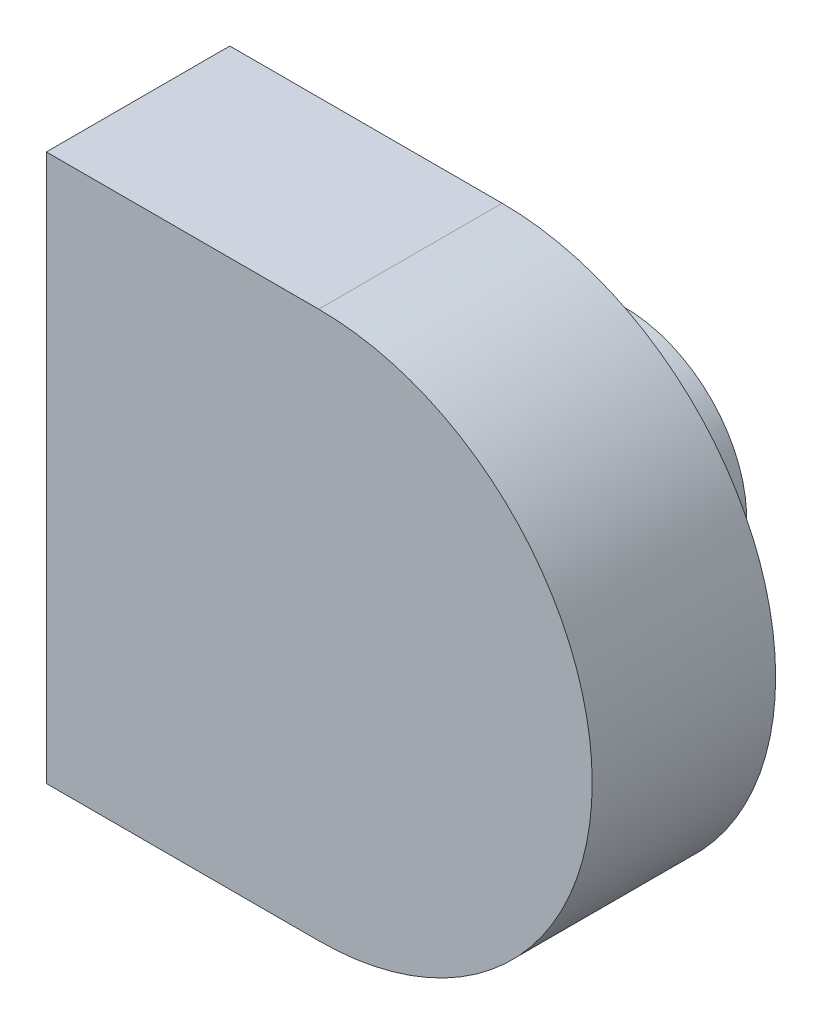
ISO-10303-21;
HEADER;
FILE_DESCRIPTION(('STEP AP214'),'2;1');
FILE_NAME('part.step','',(''),(''),'','','');
FILE_SCHEMA(('AUTOMOTIVE_DESIGN { 1 0 10303 214 1 1 1 1 }'));
ENDSEC;
DATA;
#1=APPLICATION_CONTEXT('core data for automotive mechanical design processes');
#2=APPLICATION_PROTOCOL_DEFINITION('international standard','automotive_design',2000,#1);
#3=PRODUCT_CONTEXT('',#1,'mechanical');
#4=PRODUCT('Part','Part','',(#3));
#5=PRODUCT_RELATED_PRODUCT_CATEGORY('part','',(#4));
#6=PRODUCT_DEFINITION_FORMATION('','',#4);
#7=PRODUCT_DEFINITION_CONTEXT('part definition',#1,'design');
#8=PRODUCT_DEFINITION('design','',#6,#7);
#9=PRODUCT_DEFINITION_SHAPE('','',#8);
#10=(LENGTH_UNIT() NAMED_UNIT(*) SI_UNIT(.MILLI.,.METRE.));
#11=(NAMED_UNIT(*) PLANE_ANGLE_UNIT() SI_UNIT($,.RADIAN.));
#12=(NAMED_UNIT(*) SI_UNIT($,.STERADIAN.) SOLID_ANGLE_UNIT());
#13=UNCERTAINTY_MEASURE_WITH_UNIT(LENGTH_MEASURE(1.E-05),#10,'distance_accuracy_value','');
#14=(GEOMETRIC_REPRESENTATION_CONTEXT(3) GLOBAL_UNCERTAINTY_ASSIGNED_CONTEXT((#13)) GLOBAL_UNIT_ASSIGNED_CONTEXT((#10,
#11,#12)) REPRESENTATION_CONTEXT('',''));
#15=CARTESIAN_POINT('',(0.,0.,0.));
#16=DIRECTION('',(0.,0.,1.));
#17=DIRECTION('',(1.,0.,0.));
#18=AXIS2_PLACEMENT_3D('',#15,#16,#17);
#19=CARTESIAN_POINT('',(22.27,22.365,-10.));
#20=DIRECTION('',(0.,0.,1.));
#21=DIRECTION('',(1.,0.,0.));
#22=AXIS2_PLACEMENT_3D('',#19,#20,#21);
#23=CYLINDRICAL_SURFACE('',#22,10.);
#24=CARTESIAN_POINT('',(22.27,22.365,-2.5));
#25=DIRECTION('',(0.,0.,-1.));
#26=DIRECTION('',(-1.,0.,0.));
#27=AXIS2_PLACEMENT_3D('',#24,#25,#26);
#28=CIRCLE('',#27,10.);
#29=CARTESIAN_POINT('',(12.27,22.365,-2.5));
#30=VERTEX_POINT('',#29);
#31=EDGE_CURVE('E126',#30,#30,#28,.T.);
#32=ORIENTED_EDGE('',*,*,#31,.T.);
#33=EDGE_LOOP('',(#32));
#34=FACE_BOUND('',#33,.T.);
#35=CARTESIAN_POINT('',(22.27,22.365,-10.));
#36=DIRECTION('',(0.,0.,-1.));
#37=DIRECTION('',(-1.,0.,0.));
#38=AXIS2_PLACEMENT_3D('',#35,#36,#37);
#39=CIRCLE('',#38,10.);
#40=CARTESIAN_POINT('',(12.27,22.365,-10.));
#41=VERTEX_POINT('',#40);
#42=EDGE_CURVE('E114',#41,#41,#39,.T.);
#43=ORIENTED_EDGE('',*,*,#42,.F.);
#44=EDGE_LOOP('',(#43));
#45=FACE_BOUND('',#44,.T.);
#46=ADVANCED_FACE('F44',(#34,#45),#23,.T.);
#47=CARTESIAN_POINT('',(0.,0.,-10.));
#48=DIRECTION('',(0.,0.,-1.));
#49=DIRECTION('',(-1.,0.,0.));
#50=AXIS2_PLACEMENT_3D('',#47,#48,#49);
#51=PLANE('',#50);
#52=CARTESIAN_POINT('',(22.27,29.365,-10.));
#53=DIRECTION('',(0.,0.,-1.));
#54=DIRECTION('',(-1.,0.,0.));
#55=AXIS2_PLACEMENT_3D('',#52,#53,#54);
#56=CIRCLE('',#55,0.999999999999998);
#57=CARTESIAN_POINT('',(21.27,29.365,-10.));
#58=VERTEX_POINT('',#57);
#59=EDGE_CURVE('E118',#58,#58,#56,.T.);
#60=ORIENTED_EDGE('',*,*,#59,.F.);
#61=EDGE_LOOP('',(#60));
#62=FACE_BOUND('',#61,.T.);
#63=ORIENTED_EDGE('',*,*,#42,.T.);
#64=EDGE_LOOP('',(#63));
#65=FACE_BOUND('',#64,.T.);
#66=ADVANCED_FACE('F152',(#62,#65),#51,.T.);
#67=CARTESIAN_POINT('',(22.27,29.365,-5.));
#68=DIRECTION('',(0.,0.,-1.));
#69=DIRECTION('',(-1.,0.,0.));
#70=AXIS2_PLACEMENT_3D('',#67,#68,#69);
#71=CYLINDRICAL_SURFACE('',#70,0.999999999999998);
#72=CARTESIAN_POINT('',(22.27,29.365,-5.));
#73=DIRECTION('',(0.,0.,-1.));
#74=DIRECTION('',(-1.,0.,0.));
#75=AXIS2_PLACEMENT_3D('',#72,#73,#74);
#76=CIRCLE('',#75,0.999999999999998);
#77=CARTESIAN_POINT('',(21.27,29.365,-5.));
#78=VERTEX_POINT('',#77);
#79=EDGE_CURVE('E117',#78,#78,#76,.T.);
#80=ORIENTED_EDGE('',*,*,#79,.F.);
#81=EDGE_LOOP('',(#80));
#82=FACE_BOUND('',#81,.T.);
#83=ORIENTED_EDGE('',*,*,#59,.T.);
#84=EDGE_LOOP('',(#83));
#85=FACE_BOUND('',#84,.T.);
#86=ADVANCED_FACE('F147',(#82,#85),#71,.F.);
#87=CARTESIAN_POINT('',(22.27,29.365,-5.));
#88=DIRECTION('',(0.,0.,-1.));
#89=DIRECTION('',(-1.,0.,0.));
#90=AXIS2_PLACEMENT_3D('',#87,#88,#89);
#91=PLANE('',#90);
#92=ORIENTED_EDGE('',*,*,#79,.T.);
#93=EDGE_LOOP('',(#92));
#94=FACE_BOUND('',#93,.T.);
#95=ADVANCED_FACE('F136',(#94),#91,.T.);
#96=CARTESIAN_POINT('',(22.27,22.365,-2.5));
#97=DIRECTION('',(0.,0.,-1.));
#98=DIRECTION('',(-1.,0.,0.));
#99=AXIS2_PLACEMENT_3D('',#96,#97,#98);
#100=PLANE('',#99);
#101=CARTESIAN_POINT('',(22.27,22.365,-2.5));
#102=DIRECTION('',(0.,0.,-1.));
#103=DIRECTION('',(-1.,0.,0.));
#104=AXIS2_PLACEMENT_3D('',#101,#102,#103);
#105=CIRCLE('',#104,12.);
#106=CARTESIAN_POINT('',(10.27,22.365,-2.5));
#107=VERTEX_POINT('',#106);
#108=EDGE_CURVE('E125',#107,#107,#105,.T.);
#109=ORIENTED_EDGE('',*,*,#108,.T.);
#110=EDGE_LOOP('',(#109));
#111=FACE_BOUND('',#110,.T.);
#112=ORIENTED_EDGE('',*,*,#31,.F.);
#113=EDGE_LOOP('',(#112));
#114=FACE_BOUND('',#113,.T.);
#115=ADVANCED_FACE('F137',(#111,#114),#100,.T.);
#116=CARTESIAN_POINT('',(22.27,22.365,-2.5));
#117=DIRECTION('',(0.,0.,1.));
#118=DIRECTION('',(1.,0.,0.));
#119=AXIS2_PLACEMENT_3D('',#116,#117,#118);
#120=CYLINDRICAL_SURFACE('',#119,12.);
#121=ORIENTED_EDGE('',*,*,#108,.F.);
#122=EDGE_LOOP('',(#121));
#123=FACE_BOUND('',#122,.T.);
#124=CARTESIAN_POINT('',(22.27,22.365,0.));
#125=DIRECTION('',(0.,0.,-1.));
#126=DIRECTION('',(-1.,0.,0.));
#127=AXIS2_PLACEMENT_3D('',#124,#125,#126);
#128=CIRCLE('',#127,12.);
#129=CARTESIAN_POINT('',(10.27,22.365,0.));
#130=VERTEX_POINT('',#129);
#131=EDGE_CURVE('E123',#130,#130,#128,.T.);
#132=ORIENTED_EDGE('',*,*,#131,.T.);
#133=EDGE_LOOP('',(#132));
#134=FACE_BOUND('',#133,.T.);
#135=ADVANCED_FACE('F140',(#123,#134),#120,.T.);
#136=CARTESIAN_POINT('',(0.,0.,15.));
#137=DIRECTION('',(0.,0.,-1.));
#138=DIRECTION('',(-1.,0.,0.));
#139=AXIS2_PLACEMENT_3D('',#136,#137,#138);
#140=PLANE('',#139);
#141=CARTESIAN_POINT('',(22.27,22.365,15.));
#142=DIRECTION('',(0.,0.,1.));
#143=DIRECTION('',(1.,0.,0.));
#144=AXIS2_PLACEMENT_3D('',#141,#142,#143);
#145=CIRCLE('',#144,22.365);
#146=CARTESIAN_POINT('',(22.27,0.,15.));
#147=VERTEX_POINT('',#146);
#148=CARTESIAN_POINT('',(22.27,44.73,15.));
#149=VERTEX_POINT('',#148);
#150=EDGE_CURVE('E109',#147,#149,#145,.T.);
#151=ORIENTED_EDGE('',*,*,#150,.T.);
#152=DIRECTION('',(-1.,0.,0.));
#153=VECTOR('',#152,1.);
#154=CARTESIAN_POINT('',(0.,44.73,15.));
#155=LINE('',#154,#153);
#156=CARTESIAN_POINT('',(0.,44.73,15.));
#157=VERTEX_POINT('',#156);
#158=EDGE_CURVE('E70',#149,#157,#155,.T.);
#159=ORIENTED_EDGE('',*,*,#158,.T.);
#160=DIRECTION('',(0.,-1.,0.));
#161=VECTOR('',#160,1.);
#162=CARTESIAN_POINT('',(0.,0.,15.));
#163=LINE('',#162,#161);
#164=CARTESIAN_POINT('',(0.,0.,15.));
#165=VERTEX_POINT('',#164);
#166=EDGE_CURVE('E94',#157,#165,#163,.T.);
#167=ORIENTED_EDGE('',*,*,#166,.T.);
#168=DIRECTION('',(1.,0.,0.));
#169=VECTOR('',#168,1.);
#170=CARTESIAN_POINT('',(0.,0.,15.));
#171=LINE('',#170,#169);
#172=EDGE_CURVE('E106',#165,#147,#171,.T.);
#173=ORIENTED_EDGE('',*,*,#172,.T.);
#174=EDGE_LOOP('',(#151,#159,#167,#173));
#175=FACE_BOUND('',#174,.T.);
#176=ADVANCED_FACE('F148',(#175),#140,.F.);
#177=CARTESIAN_POINT('',(0.,0.,15.));
#178=DIRECTION('',(1.,0.,0.));
#179=DIRECTION('',(0.,0.,-1.));
#180=AXIS2_PLACEMENT_3D('',#177,#178,#179);
#181=PLANE('',#180);
#182=DIRECTION('',(0.,-1.,0.));
#183=VECTOR('',#182,1.);
#184=CARTESIAN_POINT('',(0.,0.,0.));
#185=LINE('',#184,#183);
#186=CARTESIAN_POINT('',(0.,44.73,0.));
#187=VERTEX_POINT('',#186);
#188=CARTESIAN_POINT('',(0.,0.,0.));
#189=VERTEX_POINT('',#188);
#190=EDGE_CURVE('E96',#187,#189,#185,.T.);
#191=ORIENTED_EDGE('',*,*,#190,.T.);
#192=DIRECTION('',(0.,0.,-1.));
#193=VECTOR('',#192,1.);
#194=CARTESIAN_POINT('',(0.,0.,15.));
#195=LINE('',#194,#193);
#196=EDGE_CURVE('E11',#165,#189,#195,.T.);
#197=ORIENTED_EDGE('',*,*,#196,.F.);
#198=ORIENTED_EDGE('',*,*,#166,.F.);
#199=DIRECTION('',(0.,0.,-1.));
#200=VECTOR('',#199,1.);
#201=CARTESIAN_POINT('',(0.,44.73,15.));
#202=LINE('',#201,#200);
#203=EDGE_CURVE('E52',#157,#187,#202,.T.);
#204=ORIENTED_EDGE('',*,*,#203,.T.);
#205=EDGE_LOOP('',(#191,#197,#198,#204));
#206=FACE_BOUND('',#205,.T.);
#207=ADVANCED_FACE('F50',(#206),#181,.F.);
#208=CARTESIAN_POINT('',(0.,0.,15.));
#209=DIRECTION('',(0.,1.,0.));
#210=DIRECTION('',(0.,0.,1.));
#211=AXIS2_PLACEMENT_3D('',#208,#209,#210);
#212=PLANE('',#211);
#213=DIRECTION('',(1.,0.,0.));
#214=VECTOR('',#213,1.);
#215=CARTESIAN_POINT('',(0.,0.,0.));
#216=LINE('',#215,#214);
#217=CARTESIAN_POINT('',(22.27,0.,0.));
#218=VERTEX_POINT('',#217);
#219=EDGE_CURVE('E95',#189,#218,#216,.T.);
#220=ORIENTED_EDGE('',*,*,#219,.T.);
#221=DIRECTION('',(0.,0.,1.));
#222=VECTOR('',#221,1.);
#223=CARTESIAN_POINT('',(22.27,0.,-0.000999999999999265));
#224=LINE('',#223,#222);
#225=EDGE_CURVE('E58',#218,#147,#224,.T.);
#226=ORIENTED_EDGE('',*,*,#225,.T.);
#227=ORIENTED_EDGE('',*,*,#172,.F.);
#228=ORIENTED_EDGE('',*,*,#196,.T.);
#229=EDGE_LOOP('',(#220,#226,#227,#228));
#230=FACE_BOUND('',#229,.T.);
#231=ADVANCED_FACE('F164',(#230),#212,.F.);
#232=CARTESIAN_POINT('',(22.27,22.365,-0.000999999999999265));
#233=DIRECTION('',(0.,0.,1.));
#234=DIRECTION('',(1.,0.,0.));
#235=AXIS2_PLACEMENT_3D('',#232,#233,#234);
#236=CYLINDRICAL_SURFACE('',#235,22.365);
#237=CARTESIAN_POINT('',(22.27,22.365,0.));
#238=DIRECTION('',(0.,0.,-1.));
#239=DIRECTION('',(-1.,0.,0.));
#240=AXIS2_PLACEMENT_3D('',#237,#238,#239);
#241=CIRCLE('',#240,22.365);
#242=CARTESIAN_POINT('',(22.27,44.73,0.));
#243=VERTEX_POINT('',#242);
#244=EDGE_CURVE('E113',#218,#243,#241,.F.);
#245=ORIENTED_EDGE('',*,*,#244,.T.);
#246=DIRECTION('',(0.,0.,1.));
#247=VECTOR('',#246,1.);
#248=CARTESIAN_POINT('',(22.27,44.73,-0.000999999999999265));
#249=LINE('',#248,#247);
#250=EDGE_CURVE('E90',#243,#149,#249,.T.);
#251=ORIENTED_EDGE('',*,*,#250,.T.);
#252=ORIENTED_EDGE('',*,*,#150,.F.);
#253=ORIENTED_EDGE('',*,*,#225,.F.);
#254=EDGE_LOOP('',(#245,#251,#252,#253));
#255=FACE_BOUND('',#254,.T.);
#256=ADVANCED_FACE('F162',(#255),#236,.T.);
#257=CARTESIAN_POINT('',(0.,44.73,15.));
#258=DIRECTION('',(0.,-1.,0.));
#259=DIRECTION('',(0.,0.,-1.));
#260=AXIS2_PLACEMENT_3D('',#257,#258,#259);
#261=PLANE('',#260);
#262=ORIENTED_EDGE('',*,*,#250,.F.);
#263=DIRECTION('',(-1.,0.,0.));
#264=VECTOR('',#263,1.);
#265=CARTESIAN_POINT('',(0.,44.73,0.));
#266=LINE('',#265,#264);
#267=EDGE_CURVE('E81',#243,#187,#266,.T.);
#268=ORIENTED_EDGE('',*,*,#267,.T.);
#269=ORIENTED_EDGE('',*,*,#203,.F.);
#270=ORIENTED_EDGE('',*,*,#158,.F.);
#271=EDGE_LOOP('',(#262,#268,#269,#270));
#272=FACE_BOUND('',#271,.T.);
#273=ADVANCED_FACE('F82',(#272),#261,.F.);
#274=CARTESIAN_POINT('',(0.,0.,0.));
#275=DIRECTION('',(0.,0.,-1.));
#276=DIRECTION('',(-1.,0.,0.));
#277=AXIS2_PLACEMENT_3D('',#274,#275,#276);
#278=PLANE('',#277);
#279=ORIENTED_EDGE('',*,*,#131,.F.);
#280=EDGE_LOOP('',(#279));
#281=FACE_BOUND('',#280,.T.);
#282=ORIENTED_EDGE('',*,*,#267,.F.);
#283=ORIENTED_EDGE('',*,*,#244,.F.);
#284=ORIENTED_EDGE('',*,*,#219,.F.);
#285=ORIENTED_EDGE('',*,*,#190,.F.);
#286=EDGE_LOOP('',(#282,#283,#284,#285));
#287=FACE_BOUND('',#286,.T.);
#288=ADVANCED_FACE('F100',(#281,#287),#278,.T.);
#289=CLOSED_SHELL('',(#46,#66,#86,#95,#115,#135,#176,#207,#231,#256,#273,#288));
#290=MANIFOLD_SOLID_BREP('B2',#289);
#291=ADVANCED_BREP_SHAPE_REPRESENTATION('',(#18,#290),#14);
#292=SHAPE_DEFINITION_REPRESENTATION(#9,#291);
ENDSEC;
END-ISO-10303-21;
